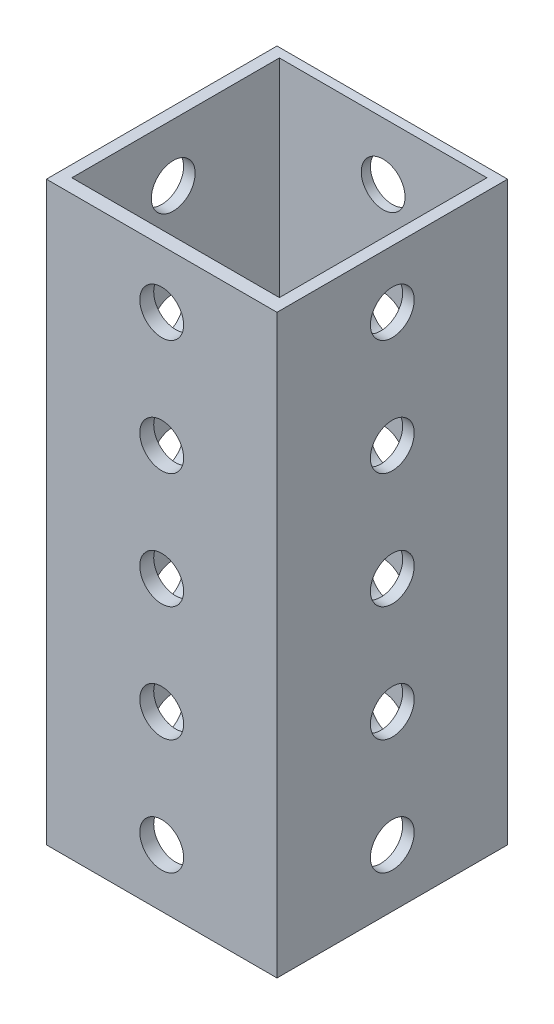
ISO-10303-21;
HEADER;
FILE_DESCRIPTION(('STEP AP214'),'2;1');
FILE_NAME('part.step','',(''),(''),'','','');
FILE_SCHEMA(('AUTOMOTIVE_DESIGN { 1 0 10303 214 1 1 1 1 }'));
ENDSEC;
DATA;
#1=APPLICATION_CONTEXT('core data for automotive mechanical design processes');
#2=APPLICATION_PROTOCOL_DEFINITION('international standard','automotive_design',2000,#1);
#3=PRODUCT_CONTEXT('',#1,'mechanical');
#4=PRODUCT('Part','Part','',(#3));
#5=PRODUCT_RELATED_PRODUCT_CATEGORY('part','',(#4));
#6=PRODUCT_DEFINITION_FORMATION('','',#4);
#7=PRODUCT_DEFINITION_CONTEXT('part definition',#1,'design');
#8=PRODUCT_DEFINITION('design','',#6,#7);
#9=PRODUCT_DEFINITION_SHAPE('','',#8);
#10=(LENGTH_UNIT() NAMED_UNIT(*) SI_UNIT(.MILLI.,.METRE.));
#11=(NAMED_UNIT(*) PLANE_ANGLE_UNIT() SI_UNIT($,.RADIAN.));
#12=(NAMED_UNIT(*) SI_UNIT($,.STERADIAN.) SOLID_ANGLE_UNIT());
#13=UNCERTAINTY_MEASURE_WITH_UNIT(LENGTH_MEASURE(1.E-05),#10,'distance_accuracy_value','');
#14=(GEOMETRIC_REPRESENTATION_CONTEXT(3) GLOBAL_UNCERTAINTY_ASSIGNED_CONTEXT((#13)) GLOBAL_UNIT_ASSIGNED_CONTEXT((#10,
#11,#12)) REPRESENTATION_CONTEXT('',''));
#15=CARTESIAN_POINT('',(0.,0.,0.));
#16=DIRECTION('',(0.,0.,1.));
#17=DIRECTION('',(1.,0.,0.));
#18=AXIS2_PLACEMENT_3D('',#15,#16,#17);
#19=CARTESIAN_POINT('',(0.,63.5,0.));
#20=DIRECTION('',(0.,-1.,0.));
#21=DIRECTION('',(0.,0.,-1.));
#22=AXIS2_PLACEMENT_3D('',#19,#20,#21);
#23=PLANE('',#22);
#24=DIRECTION('',(0.,0.,-1.));
#25=VECTOR('',#24,1.);
#26=CARTESIAN_POINT('',(12.7,63.5,12.7));
#27=LINE('',#26,#25);
#28=CARTESIAN_POINT('',(12.7,63.5,12.7));
#29=VERTEX_POINT('',#28);
#30=CARTESIAN_POINT('',(12.7,63.5,-12.7));
#31=VERTEX_POINT('',#30);
#32=EDGE_CURVE('E140',#29,#31,#27,.T.);
#33=ORIENTED_EDGE('',*,*,#32,.T.);
#34=DIRECTION('',(-1.,0.,0.));
#35=VECTOR('',#34,1.);
#36=CARTESIAN_POINT('',(-12.7,63.5,-12.7));
#37=LINE('',#36,#35);
#38=CARTESIAN_POINT('',(-12.7,63.5,-12.7));
#39=VERTEX_POINT('',#38);
#40=EDGE_CURVE('E143',#31,#39,#37,.T.);
#41=ORIENTED_EDGE('',*,*,#40,.T.);
#42=DIRECTION('',(0.,0.,1.));
#43=VECTOR('',#42,1.);
#44=CARTESIAN_POINT('',(-12.7,63.5,12.7));
#45=LINE('',#44,#43);
#46=CARTESIAN_POINT('',(-12.7,63.5,12.7));
#47=VERTEX_POINT('',#46);
#48=EDGE_CURVE('E146',#39,#47,#45,.T.);
#49=ORIENTED_EDGE('',*,*,#48,.T.);
#50=DIRECTION('',(1.,0.,0.));
#51=VECTOR('',#50,1.);
#52=CARTESIAN_POINT('',(-12.7,63.5,12.7));
#53=LINE('',#52,#51);
#54=EDGE_CURVE('E148',#47,#29,#53,.T.);
#55=ORIENTED_EDGE('',*,*,#54,.T.);
#56=EDGE_LOOP('',(#33,#41,#49,#55));
#57=FACE_BOUND('',#56,.T.);
#58=DIRECTION('',(0.,0.,-1.));
#59=VECTOR('',#58,1.);
#60=CARTESIAN_POINT('',(11.43,63.5,11.1674519230769));
#61=LINE('',#60,#59);
#62=CARTESIAN_POINT('',(11.43,63.5,11.1674519230769));
#63=VERTEX_POINT('',#62);
#64=CARTESIAN_POINT('',(11.43,63.5,-11.6925480769231));
#65=VERTEX_POINT('',#64);
#66=EDGE_CURVE('E102',#63,#65,#61,.T.);
#67=ORIENTED_EDGE('',*,*,#66,.F.);
#68=DIRECTION('',(1.,0.,0.));
#69=VECTOR('',#68,1.);
#70=CARTESIAN_POINT('',(-11.43,63.5,11.1674519230769));
#71=LINE('',#70,#69);
#72=CARTESIAN_POINT('',(-11.43,63.5,11.1674519230769));
#73=VERTEX_POINT('',#72);
#74=EDGE_CURVE('E124',#73,#63,#71,.T.);
#75=ORIENTED_EDGE('',*,*,#74,.F.);
#76=DIRECTION('',(0.,0.,1.));
#77=VECTOR('',#76,1.);
#78=CARTESIAN_POINT('',(-11.43,63.5,11.1674519230769));
#79=LINE('',#78,#77);
#80=CARTESIAN_POINT('',(-11.43,63.5,-11.6925480769231));
#81=VERTEX_POINT('',#80);
#82=EDGE_CURVE('E122',#81,#73,#79,.T.);
#83=ORIENTED_EDGE('',*,*,#82,.F.);
#84=DIRECTION('',(-1.,0.,0.));
#85=VECTOR('',#84,1.);
#86=CARTESIAN_POINT('',(-11.43,63.5,-11.6925480769231));
#87=LINE('',#86,#85);
#88=EDGE_CURVE('E110',#65,#81,#87,.T.);
#89=ORIENTED_EDGE('',*,*,#88,.F.);
#90=EDGE_LOOP('',(#67,#75,#83,#89));
#91=FACE_BOUND('',#90,.T.);
#92=ADVANCED_FACE('F35',(#57,#91),#23,.F.);
#93=CARTESIAN_POINT('',(0.,0.,0.));
#94=DIRECTION('',(0.,-1.,0.));
#95=DIRECTION('',(0.,0.,-1.));
#96=AXIS2_PLACEMENT_3D('',#93,#94,#95);
#97=PLANE('',#96);
#98=DIRECTION('',(0.,0.,-1.));
#99=VECTOR('',#98,1.);
#100=CARTESIAN_POINT('',(12.7,0.,12.7));
#101=LINE('',#100,#99);
#102=CARTESIAN_POINT('',(12.7,0.,12.7));
#103=VERTEX_POINT('',#102);
#104=CARTESIAN_POINT('',(12.7,0.,-12.7));
#105=VERTEX_POINT('',#104);
#106=EDGE_CURVE('E118',#103,#105,#101,.T.);
#107=ORIENTED_EDGE('',*,*,#106,.F.);
#108=DIRECTION('',(1.,0.,0.));
#109=VECTOR('',#108,1.);
#110=CARTESIAN_POINT('',(-12.7,0.,12.7));
#111=LINE('',#110,#109);
#112=CARTESIAN_POINT('',(-12.7,0.,12.7));
#113=VERTEX_POINT('',#112);
#114=EDGE_CURVE('E144',#113,#103,#111,.T.);
#115=ORIENTED_EDGE('',*,*,#114,.F.);
#116=DIRECTION('',(0.,0.,1.));
#117=VECTOR('',#116,1.);
#118=CARTESIAN_POINT('',(-12.7,0.,12.7));
#119=LINE('',#118,#117);
#120=CARTESIAN_POINT('',(-12.7,0.,-12.7));
#121=VERTEX_POINT('',#120);
#122=EDGE_CURVE('E155',#121,#113,#119,.T.);
#123=ORIENTED_EDGE('',*,*,#122,.F.);
#124=DIRECTION('',(-1.,0.,0.));
#125=VECTOR('',#124,1.);
#126=CARTESIAN_POINT('',(-12.7,0.,-12.7));
#127=LINE('',#126,#125);
#128=EDGE_CURVE('E153',#105,#121,#127,.T.);
#129=ORIENTED_EDGE('',*,*,#128,.F.);
#130=EDGE_LOOP('',(#107,#115,#123,#129));
#131=FACE_BOUND('',#130,.T.);
#132=DIRECTION('',(1.,0.,0.));
#133=VECTOR('',#132,1.);
#134=CARTESIAN_POINT('',(-11.43,0.,11.1674519230769));
#135=LINE('',#134,#133);
#136=CARTESIAN_POINT('',(-11.43,0.,11.1674519230769));
#137=VERTEX_POINT('',#136);
#138=CARTESIAN_POINT('',(11.43,0.,11.1674519230769));
#139=VERTEX_POINT('',#138);
#140=EDGE_CURVE('E111',#137,#139,#135,.T.);
#141=ORIENTED_EDGE('',*,*,#140,.T.);
#142=DIRECTION('',(0.,0.,-1.));
#143=VECTOR('',#142,1.);
#144=CARTESIAN_POINT('',(11.43,0.,11.1674519230769));
#145=LINE('',#144,#143);
#146=CARTESIAN_POINT('',(11.43,0.,-11.6925480769231));
#147=VERTEX_POINT('',#146);
#148=EDGE_CURVE('E60',#139,#147,#145,.T.);
#149=ORIENTED_EDGE('',*,*,#148,.T.);
#150=DIRECTION('',(-1.,0.,0.));
#151=VECTOR('',#150,1.);
#152=CARTESIAN_POINT('',(-11.43,0.,-11.6925480769231));
#153=LINE('',#152,#151);
#154=CARTESIAN_POINT('',(-11.43,0.,-11.6925480769231));
#155=VERTEX_POINT('',#154);
#156=EDGE_CURVE('E117',#147,#155,#153,.T.);
#157=ORIENTED_EDGE('',*,*,#156,.T.);
#158=DIRECTION('',(0.,0.,1.));
#159=VECTOR('',#158,1.);
#160=CARTESIAN_POINT('',(-11.43,0.,11.1674519230769));
#161=LINE('',#160,#159);
#162=EDGE_CURVE('E132',#155,#137,#161,.T.);
#163=ORIENTED_EDGE('',*,*,#162,.T.);
#164=EDGE_LOOP('',(#141,#149,#157,#163));
#165=FACE_BOUND('',#164,.T.);
#166=ADVANCED_FACE('F291',(#131,#165),#97,.T.);
#167=CARTESIAN_POINT('',(12.7,63.5,12.7));
#168=DIRECTION('',(-1.,0.,0.));
#169=DIRECTION('',(0.,0.,1.));
#170=AXIS2_PLACEMENT_3D('',#167,#168,#169);
#171=PLANE('',#170);
#172=CARTESIAN_POINT('',(12.7,57.15,0.));
#173=DIRECTION('',(1.,0.,0.));
#174=DIRECTION('',(0.,0.,-1.));
#175=AXIS2_PLACEMENT_3D('',#172,#173,#174);
#176=CIRCLE('',#175,2.413);
#177=CARTESIAN_POINT('',(12.7,57.15,-2.413));
#178=VERTEX_POINT('',#177);
#179=EDGE_CURVE('E568',#178,#178,#176,.T.);
#180=ORIENTED_EDGE('',*,*,#179,.F.);
#181=EDGE_LOOP('',(#180));
#182=FACE_BOUND('',#181,.T.);
#183=CARTESIAN_POINT('',(12.7,44.45,0.));
#184=DIRECTION('',(1.,0.,0.));
#185=DIRECTION('',(0.,0.,-1.));
#186=AXIS2_PLACEMENT_3D('',#183,#184,#185);
#187=CIRCLE('',#186,2.413);
#188=CARTESIAN_POINT('',(12.7,44.45,-2.413));
#189=VERTEX_POINT('',#188);
#190=EDGE_CURVE('E571',#189,#189,#187,.T.);
#191=ORIENTED_EDGE('',*,*,#190,.F.);
#192=EDGE_LOOP('',(#191));
#193=FACE_BOUND('',#192,.T.);
#194=CARTESIAN_POINT('',(12.7,31.75,0.));
#195=DIRECTION('',(1.,0.,0.));
#196=DIRECTION('',(0.,0.,-1.));
#197=AXIS2_PLACEMENT_3D('',#194,#195,#196);
#198=CIRCLE('',#197,2.413);
#199=CARTESIAN_POINT('',(12.7,31.75,-2.413));
#200=VERTEX_POINT('',#199);
#201=EDGE_CURVE('E577',#200,#200,#198,.T.);
#202=ORIENTED_EDGE('',*,*,#201,.F.);
#203=EDGE_LOOP('',(#202));
#204=FACE_BOUND('',#203,.T.);
#205=CARTESIAN_POINT('',(12.7,19.05,0.));
#206=DIRECTION('',(1.,0.,0.));
#207=DIRECTION('',(0.,0.,-1.));
#208=AXIS2_PLACEMENT_3D('',#205,#206,#207);
#209=CIRCLE('',#208,2.413);
#210=CARTESIAN_POINT('',(12.7,19.05,-2.413));
#211=VERTEX_POINT('',#210);
#212=EDGE_CURVE('E334',#211,#211,#209,.T.);
#213=ORIENTED_EDGE('',*,*,#212,.F.);
#214=EDGE_LOOP('',(#213));
#215=FACE_BOUND('',#214,.T.);
#216=CARTESIAN_POINT('',(12.7,6.35000000000002,0.));
#217=DIRECTION('',(1.,0.,0.));
#218=DIRECTION('',(0.,0.,-1.));
#219=AXIS2_PLACEMENT_3D('',#216,#217,#218);
#220=CIRCLE('',#219,2.413);
#221=CARTESIAN_POINT('',(12.7,6.35000000000002,-2.413));
#222=VERTEX_POINT('',#221);
#223=EDGE_CURVE('E335',#222,#222,#220,.T.);
#224=ORIENTED_EDGE('',*,*,#223,.F.);
#225=EDGE_LOOP('',(#224));
#226=FACE_BOUND('',#225,.T.);
#227=ORIENTED_EDGE('',*,*,#106,.T.);
#228=DIRECTION('',(0.,-1.,0.));
#229=VECTOR('',#228,1.);
#230=CARTESIAN_POINT('',(12.7,63.5,-12.7));
#231=LINE('',#230,#229);
#232=EDGE_CURVE('E11',#31,#105,#231,.T.);
#233=ORIENTED_EDGE('',*,*,#232,.F.);
#234=ORIENTED_EDGE('',*,*,#32,.F.);
#235=DIRECTION('',(0.,-1.,0.));
#236=VECTOR('',#235,1.);
#237=CARTESIAN_POINT('',(12.7,63.5,12.7));
#238=LINE('',#237,#236);
#239=EDGE_CURVE('E150',#29,#103,#238,.T.);
#240=ORIENTED_EDGE('',*,*,#239,.T.);
#241=EDGE_LOOP('',(#227,#233,#234,#240));
#242=FACE_BOUND('',#241,.T.);
#243=ADVANCED_FACE('F37',(#182,#193,#204,#215,#226,#242),#171,.F.);
#244=CARTESIAN_POINT('',(-12.7,63.5,-12.7));
#245=DIRECTION('',(0.,0.,1.));
#246=DIRECTION('',(1.,0.,0.));
#247=AXIS2_PLACEMENT_3D('',#244,#245,#246);
#248=PLANE('',#247);
#249=CARTESIAN_POINT('',(0.,57.15,-12.7));
#250=DIRECTION('',(0.,0.,-1.));
#251=DIRECTION('',(-1.,0.,0.));
#252=AXIS2_PLACEMENT_3D('',#249,#250,#251);
#253=CIRCLE('',#252,2.413);
#254=CARTESIAN_POINT('',(-2.413,57.15,-12.7));
#255=VERTEX_POINT('',#254);
#256=EDGE_CURVE('E217',#255,#255,#253,.T.);
#257=ORIENTED_EDGE('',*,*,#256,.F.);
#258=EDGE_LOOP('',(#257));
#259=FACE_BOUND('',#258,.T.);
#260=CARTESIAN_POINT('',(0.,44.45,-12.7));
#261=DIRECTION('',(0.,0.,-1.));
#262=DIRECTION('',(-1.,0.,0.));
#263=AXIS2_PLACEMENT_3D('',#260,#261,#262);
#264=CIRCLE('',#263,2.413);
#265=CARTESIAN_POINT('',(-2.413,44.45,-12.7));
#266=VERTEX_POINT('',#265);
#267=EDGE_CURVE('E223',#266,#266,#264,.T.);
#268=ORIENTED_EDGE('',*,*,#267,.F.);
#269=EDGE_LOOP('',(#268));
#270=FACE_BOUND('',#269,.T.);
#271=CARTESIAN_POINT('',(0.,31.75,-12.7));
#272=DIRECTION('',(0.,0.,-1.));
#273=DIRECTION('',(-1.,0.,0.));
#274=AXIS2_PLACEMENT_3D('',#271,#272,#273);
#275=CIRCLE('',#274,2.413);
#276=CARTESIAN_POINT('',(-2.413,31.75,-12.7));
#277=VERTEX_POINT('',#276);
#278=EDGE_CURVE('E229',#277,#277,#275,.T.);
#279=ORIENTED_EDGE('',*,*,#278,.F.);
#280=EDGE_LOOP('',(#279));
#281=FACE_BOUND('',#280,.T.);
#282=CARTESIAN_POINT('',(0.,19.05,-12.7));
#283=DIRECTION('',(0.,0.,-1.));
#284=DIRECTION('',(-1.,0.,0.));
#285=AXIS2_PLACEMENT_3D('',#282,#283,#284);
#286=CIRCLE('',#285,2.413);
#287=CARTESIAN_POINT('',(-2.413,19.05,-12.7));
#288=VERTEX_POINT('',#287);
#289=EDGE_CURVE('E235',#288,#288,#286,.T.);
#290=ORIENTED_EDGE('',*,*,#289,.F.);
#291=EDGE_LOOP('',(#290));
#292=FACE_BOUND('',#291,.T.);
#293=CARTESIAN_POINT('',(0.,6.35000000000002,-12.7));
#294=DIRECTION('',(0.,0.,-1.));
#295=DIRECTION('',(-1.,0.,0.));
#296=AXIS2_PLACEMENT_3D('',#293,#294,#295);
#297=CIRCLE('',#296,2.413);
#298=CARTESIAN_POINT('',(-2.413,6.35000000000002,-12.7));
#299=VERTEX_POINT('',#298);
#300=EDGE_CURVE('E214',#299,#299,#297,.T.);
#301=ORIENTED_EDGE('',*,*,#300,.F.);
#302=EDGE_LOOP('',(#301));
#303=FACE_BOUND('',#302,.T.);
#304=ORIENTED_EDGE('',*,*,#128,.T.);
#305=DIRECTION('',(0.,-1.,0.));
#306=VECTOR('',#305,1.);
#307=CARTESIAN_POINT('',(-12.7,63.5,-12.7));
#308=LINE('',#307,#306);
#309=EDGE_CURVE('E44',#39,#121,#308,.T.);
#310=ORIENTED_EDGE('',*,*,#309,.F.);
#311=ORIENTED_EDGE('',*,*,#40,.F.);
#312=ORIENTED_EDGE('',*,*,#232,.T.);
#313=EDGE_LOOP('',(#304,#310,#311,#312));
#314=FACE_BOUND('',#313,.T.);
#315=ADVANCED_FACE('F277',(#259,#270,#281,#292,#303,#314),#248,.F.);
#316=CARTESIAN_POINT('',(-12.7,63.5,12.7));
#317=DIRECTION('',(1.,0.,0.));
#318=DIRECTION('',(0.,0.,-1.));
#319=AXIS2_PLACEMENT_3D('',#316,#317,#318);
#320=PLANE('',#319);
#321=CARTESIAN_POINT('',(-12.7,57.15,0.));
#322=DIRECTION('',(1.,0.,0.));
#323=DIRECTION('',(0.,0.,-1.));
#324=AXIS2_PLACEMENT_3D('',#321,#322,#323);
#325=CIRCLE('',#324,2.413);
#326=CARTESIAN_POINT('',(-12.7,57.15,-2.413));
#327=VERTEX_POINT('',#326);
#328=EDGE_CURVE('E189',#327,#327,#325,.T.);
#329=ORIENTED_EDGE('',*,*,#328,.T.);
#330=EDGE_LOOP('',(#329));
#331=FACE_BOUND('',#330,.T.);
#332=CARTESIAN_POINT('',(-12.7,44.45,0.));
#333=DIRECTION('',(1.,0.,0.));
#334=DIRECTION('',(0.,0.,-1.));
#335=AXIS2_PLACEMENT_3D('',#332,#333,#334);
#336=CIRCLE('',#335,2.413);
#337=CARTESIAN_POINT('',(-12.7,44.45,-2.413));
#338=VERTEX_POINT('',#337);
#339=EDGE_CURVE('E321',#338,#338,#336,.T.);
#340=ORIENTED_EDGE('',*,*,#339,.T.);
#341=EDGE_LOOP('',(#340));
#342=FACE_BOUND('',#341,.T.);
#343=CARTESIAN_POINT('',(-12.7,31.75,0.));
#344=DIRECTION('',(1.,0.,0.));
#345=DIRECTION('',(0.,0.,-1.));
#346=AXIS2_PLACEMENT_3D('',#343,#344,#345);
#347=CIRCLE('',#346,2.413);
#348=CARTESIAN_POINT('',(-12.7,31.75,-2.413));
#349=VERTEX_POINT('',#348);
#350=EDGE_CURVE('E325',#349,#349,#347,.T.);
#351=ORIENTED_EDGE('',*,*,#350,.T.);
#352=EDGE_LOOP('',(#351));
#353=FACE_BOUND('',#352,.T.);
#354=CARTESIAN_POINT('',(-12.7,19.05,0.));
#355=DIRECTION('',(1.,0.,0.));
#356=DIRECTION('',(0.,0.,-1.));
#357=AXIS2_PLACEMENT_3D('',#354,#355,#356);
#358=CIRCLE('',#357,2.413);
#359=CARTESIAN_POINT('',(-12.7,19.05,-2.413));
#360=VERTEX_POINT('',#359);
#361=EDGE_CURVE('E329',#360,#360,#358,.T.);
#362=ORIENTED_EDGE('',*,*,#361,.T.);
#363=EDGE_LOOP('',(#362));
#364=FACE_BOUND('',#363,.T.);
#365=CARTESIAN_POINT('',(-12.7,6.35000000000002,0.));
#366=DIRECTION('',(1.,0.,0.));
#367=DIRECTION('',(0.,0.,-1.));
#368=AXIS2_PLACEMENT_3D('',#365,#366,#367);
#369=CIRCLE('',#368,2.413);
#370=CARTESIAN_POINT('',(-12.7,6.35000000000002,-2.413));
#371=VERTEX_POINT('',#370);
#372=EDGE_CURVE('E332',#371,#371,#369,.T.);
#373=ORIENTED_EDGE('',*,*,#372,.T.);
#374=EDGE_LOOP('',(#373));
#375=FACE_BOUND('',#374,.T.);
#376=ORIENTED_EDGE('',*,*,#122,.T.);
#377=DIRECTION('',(0.,-1.,0.));
#378=VECTOR('',#377,1.);
#379=CARTESIAN_POINT('',(-12.7,63.5,12.7));
#380=LINE('',#379,#378);
#381=EDGE_CURVE('E160',#47,#113,#380,.T.);
#382=ORIENTED_EDGE('',*,*,#381,.F.);
#383=ORIENTED_EDGE('',*,*,#48,.F.);
#384=ORIENTED_EDGE('',*,*,#309,.T.);
#385=EDGE_LOOP('',(#376,#382,#383,#384));
#386=FACE_BOUND('',#385,.T.);
#387=ADVANCED_FACE('F280',(#331,#342,#353,#364,#375,#386),#320,.F.);
#388=CARTESIAN_POINT('',(-12.7,63.5,12.7));
#389=DIRECTION('',(0.,0.,-1.));
#390=DIRECTION('',(-1.,0.,0.));
#391=AXIS2_PLACEMENT_3D('',#388,#389,#390);
#392=PLANE('',#391);
#393=CARTESIAN_POINT('',(0.,57.15,12.7));
#394=DIRECTION('',(0.,0.,-1.));
#395=DIRECTION('',(-1.,0.,0.));
#396=AXIS2_PLACEMENT_3D('',#393,#394,#395);
#397=CIRCLE('',#396,2.413);
#398=CARTESIAN_POINT('',(-2.413,57.15,12.7));
#399=VERTEX_POINT('',#398);
#400=EDGE_CURVE('E169',#399,#399,#397,.T.);
#401=ORIENTED_EDGE('',*,*,#400,.T.);
#402=EDGE_LOOP('',(#401));
#403=FACE_BOUND('',#402,.T.);
#404=CARTESIAN_POINT('',(0.,44.45,12.7));
#405=DIRECTION('',(0.,0.,-1.));
#406=DIRECTION('',(-1.,0.,0.));
#407=AXIS2_PLACEMENT_3D('',#404,#405,#406);
#408=CIRCLE('',#407,2.413);
#409=CARTESIAN_POINT('',(-2.413,44.45,12.7));
#410=VERTEX_POINT('',#409);
#411=EDGE_CURVE('E220',#410,#410,#408,.T.);
#412=ORIENTED_EDGE('',*,*,#411,.T.);
#413=EDGE_LOOP('',(#412));
#414=FACE_BOUND('',#413,.T.);
#415=CARTESIAN_POINT('',(0.,31.75,12.7));
#416=DIRECTION('',(0.,0.,-1.));
#417=DIRECTION('',(-1.,0.,0.));
#418=AXIS2_PLACEMENT_3D('',#415,#416,#417);
#419=CIRCLE('',#418,2.413);
#420=CARTESIAN_POINT('',(-2.413,31.75,12.7));
#421=VERTEX_POINT('',#420);
#422=EDGE_CURVE('E226',#421,#421,#419,.T.);
#423=ORIENTED_EDGE('',*,*,#422,.T.);
#424=EDGE_LOOP('',(#423));
#425=FACE_BOUND('',#424,.T.);
#426=CARTESIAN_POINT('',(0.,19.05,12.7));
#427=DIRECTION('',(0.,0.,-1.));
#428=DIRECTION('',(-1.,0.,0.));
#429=AXIS2_PLACEMENT_3D('',#426,#427,#428);
#430=CIRCLE('',#429,2.413);
#431=CARTESIAN_POINT('',(-2.413,19.05,12.7));
#432=VERTEX_POINT('',#431);
#433=EDGE_CURVE('E232',#432,#432,#430,.T.);
#434=ORIENTED_EDGE('',*,*,#433,.T.);
#435=EDGE_LOOP('',(#434));
#436=FACE_BOUND('',#435,.T.);
#437=CARTESIAN_POINT('',(0.,6.35000000000002,12.7));
#438=DIRECTION('',(0.,0.,-1.));
#439=DIRECTION('',(-1.,0.,0.));
#440=AXIS2_PLACEMENT_3D('',#437,#438,#439);
#441=CIRCLE('',#440,2.413);
#442=CARTESIAN_POINT('',(-2.413,6.35000000000002,12.7));
#443=VERTEX_POINT('',#442);
#444=EDGE_CURVE('E238',#443,#443,#441,.T.);
#445=ORIENTED_EDGE('',*,*,#444,.T.);
#446=EDGE_LOOP('',(#445));
#447=FACE_BOUND('',#446,.T.);
#448=ORIENTED_EDGE('',*,*,#114,.T.);
#449=ORIENTED_EDGE('',*,*,#239,.F.);
#450=ORIENTED_EDGE('',*,*,#54,.F.);
#451=ORIENTED_EDGE('',*,*,#381,.T.);
#452=EDGE_LOOP('',(#448,#449,#450,#451));
#453=FACE_BOUND('',#452,.T.);
#454=ADVANCED_FACE('F295',(#403,#414,#425,#436,#447,#453),#392,.F.);
#455=CARTESIAN_POINT('',(11.43,63.5,11.1674519230769));
#456=DIRECTION('',(-1.,0.,0.));
#457=DIRECTION('',(0.,0.,1.));
#458=AXIS2_PLACEMENT_3D('',#455,#456,#457);
#459=PLANE('',#458);
#460=CARTESIAN_POINT('',(11.43,57.15,0.));
#461=DIRECTION('',(-1.,0.,0.));
#462=DIRECTION('',(0.,0.,1.));
#463=AXIS2_PLACEMENT_3D('',#460,#461,#462);
#464=CIRCLE('',#463,2.413);
#465=CARTESIAN_POINT('',(11.43,57.15,2.413));
#466=VERTEX_POINT('',#465);
#467=EDGE_CURVE('E211',#466,#466,#464,.T.);
#468=ORIENTED_EDGE('',*,*,#467,.F.);
#469=EDGE_LOOP('',(#468));
#470=FACE_BOUND('',#469,.T.);
#471=CARTESIAN_POINT('',(11.43,44.45,0.));
#472=DIRECTION('',(-1.,0.,0.));
#473=DIRECTION('',(0.,0.,1.));
#474=AXIS2_PLACEMENT_3D('',#471,#472,#473);
#475=CIRCLE('',#474,2.413);
#476=CARTESIAN_POINT('',(11.43,44.45,2.413));
#477=VERTEX_POINT('',#476);
#478=EDGE_CURVE('E199',#477,#477,#475,.T.);
#479=ORIENTED_EDGE('',*,*,#478,.F.);
#480=EDGE_LOOP('',(#479));
#481=FACE_BOUND('',#480,.T.);
#482=CARTESIAN_POINT('',(11.43,31.75,0.));
#483=DIRECTION('',(-1.,0.,0.));
#484=DIRECTION('',(0.,0.,1.));
#485=AXIS2_PLACEMENT_3D('',#482,#483,#484);
#486=CIRCLE('',#485,2.413);
#487=CARTESIAN_POINT('',(11.43,31.75,2.413));
#488=VERTEX_POINT('',#487);
#489=EDGE_CURVE('E196',#488,#488,#486,.T.);
#490=ORIENTED_EDGE('',*,*,#489,.F.);
#491=EDGE_LOOP('',(#490));
#492=FACE_BOUND('',#491,.T.);
#493=CARTESIAN_POINT('',(11.43,19.05,0.));
#494=DIRECTION('',(-1.,0.,0.));
#495=DIRECTION('',(0.,0.,1.));
#496=AXIS2_PLACEMENT_3D('',#493,#494,#495);
#497=CIRCLE('',#496,2.413);
#498=CARTESIAN_POINT('',(11.43,19.05,2.413));
#499=VERTEX_POINT('',#498);
#500=EDGE_CURVE('E193',#499,#499,#497,.T.);
#501=ORIENTED_EDGE('',*,*,#500,.F.);
#502=EDGE_LOOP('',(#501));
#503=FACE_BOUND('',#502,.T.);
#504=CARTESIAN_POINT('',(11.43,6.35000000000002,0.));
#505=DIRECTION('',(-1.,0.,0.));
#506=DIRECTION('',(0.,0.,1.));
#507=AXIS2_PLACEMENT_3D('',#504,#505,#506);
#508=CIRCLE('',#507,2.413);
#509=CARTESIAN_POINT('',(11.43,6.35000000000002,2.413));
#510=VERTEX_POINT('',#509);
#511=EDGE_CURVE('E188',#510,#510,#508,.T.);
#512=ORIENTED_EDGE('',*,*,#511,.F.);
#513=EDGE_LOOP('',(#512));
#514=FACE_BOUND('',#513,.T.);
#515=ORIENTED_EDGE('',*,*,#148,.F.);
#516=DIRECTION('',(0.,-1.,0.));
#517=VECTOR('',#516,1.);
#518=CARTESIAN_POINT('',(11.43,63.5,11.1674519230769));
#519=LINE('',#518,#517);
#520=EDGE_CURVE('E106',#63,#139,#519,.T.);
#521=ORIENTED_EDGE('',*,*,#520,.F.);
#522=ORIENTED_EDGE('',*,*,#66,.T.);
#523=DIRECTION('',(0.,-1.,0.));
#524=VECTOR('',#523,1.);
#525=CARTESIAN_POINT('',(11.43,63.5,-11.6925480769231));
#526=LINE('',#525,#524);
#527=EDGE_CURVE('E105',#65,#147,#526,.T.);
#528=ORIENTED_EDGE('',*,*,#527,.T.);
#529=EDGE_LOOP('',(#515,#521,#522,#528));
#530=FACE_BOUND('',#529,.T.);
#531=ADVANCED_FACE('F104',(#470,#481,#492,#503,#514,#530),#459,.T.);
#532=CARTESIAN_POINT('',(-11.43,63.5,-11.6925480769231));
#533=DIRECTION('',(0.,0.,1.));
#534=DIRECTION('',(1.,0.,0.));
#535=AXIS2_PLACEMENT_3D('',#532,#533,#534);
#536=PLANE('',#535);
#537=CARTESIAN_POINT('',(0.,57.15,-11.6925480769231));
#538=DIRECTION('',(0.,0.,1.));
#539=DIRECTION('',(1.,0.,0.));
#540=AXIS2_PLACEMENT_3D('',#537,#538,#539);
#541=CIRCLE('',#540,2.413);
#542=CARTESIAN_POINT('',(2.413,57.15,-11.6925480769231));
#543=VERTEX_POINT('',#542);
#544=EDGE_CURVE('E130',#543,#543,#541,.T.);
#545=ORIENTED_EDGE('',*,*,#544,.F.);
#546=EDGE_LOOP('',(#545));
#547=FACE_BOUND('',#546,.T.);
#548=CARTESIAN_POINT('',(0.,44.45,-11.6925480769231));
#549=DIRECTION('',(0.,0.,1.));
#550=DIRECTION('',(1.,0.,0.));
#551=AXIS2_PLACEMENT_3D('',#548,#549,#550);
#552=CIRCLE('',#551,2.413);
#553=CARTESIAN_POINT('',(2.41299999999999,44.45,-11.6925480769231));
#554=VERTEX_POINT('',#553);
#555=EDGE_CURVE('E181',#554,#554,#552,.T.);
#556=ORIENTED_EDGE('',*,*,#555,.F.);
#557=EDGE_LOOP('',(#556));
#558=FACE_BOUND('',#557,.T.);
#559=CARTESIAN_POINT('',(0.,31.75,-11.6925480769231));
#560=DIRECTION('',(0.,0.,1.));
#561=DIRECTION('',(1.,0.,0.));
#562=AXIS2_PLACEMENT_3D('',#559,#560,#561);
#563=CIRCLE('',#562,2.413);
#564=CARTESIAN_POINT('',(2.41299999999999,31.75,-11.6925480769231));
#565=VERTEX_POINT('',#564);
#566=EDGE_CURVE('E177',#565,#565,#563,.T.);
#567=ORIENTED_EDGE('',*,*,#566,.F.);
#568=EDGE_LOOP('',(#567));
#569=FACE_BOUND('',#568,.T.);
#570=CARTESIAN_POINT('',(0.,19.05,-11.6925480769231));
#571=DIRECTION('',(0.,0.,1.));
#572=DIRECTION('',(1.,0.,0.));
#573=AXIS2_PLACEMENT_3D('',#570,#571,#572);
#574=CIRCLE('',#573,2.413);
#575=CARTESIAN_POINT('',(2.41299999999999,19.05,-11.6925480769231));
#576=VERTEX_POINT('',#575);
#577=EDGE_CURVE('E173',#576,#576,#574,.T.);
#578=ORIENTED_EDGE('',*,*,#577,.F.);
#579=EDGE_LOOP('',(#578));
#580=FACE_BOUND('',#579,.T.);
#581=CARTESIAN_POINT('',(0.,6.35000000000002,-11.6925480769231));
#582=DIRECTION('',(0.,0.,1.));
#583=DIRECTION('',(1.,0.,0.));
#584=AXIS2_PLACEMENT_3D('',#581,#582,#583);
#585=CIRCLE('',#584,2.413);
#586=CARTESIAN_POINT('',(2.41299999999999,6.35000000000002,-11.6925480769231));
#587=VERTEX_POINT('',#586);
#588=EDGE_CURVE('E168',#587,#587,#585,.T.);
#589=ORIENTED_EDGE('',*,*,#588,.F.);
#590=EDGE_LOOP('',(#589));
#591=FACE_BOUND('',#590,.T.);
#592=ORIENTED_EDGE('',*,*,#156,.F.);
#593=ORIENTED_EDGE('',*,*,#527,.F.);
#594=ORIENTED_EDGE('',*,*,#88,.T.);
#595=DIRECTION('',(0.,-1.,0.));
#596=VECTOR('',#595,1.);
#597=CARTESIAN_POINT('',(-11.43,63.5,-11.6925480769231));
#598=LINE('',#597,#596);
#599=EDGE_CURVE('E119',#81,#155,#598,.T.);
#600=ORIENTED_EDGE('',*,*,#599,.T.);
#601=EDGE_LOOP('',(#592,#593,#594,#600));
#602=FACE_BOUND('',#601,.T.);
#603=ADVANCED_FACE('F114',(#547,#558,#569,#580,#591,#602),#536,.T.);
#604=CARTESIAN_POINT('',(-11.43,63.5,11.1674519230769));
#605=DIRECTION('',(1.,0.,0.));
#606=DIRECTION('',(0.,0.,-1.));
#607=AXIS2_PLACEMENT_3D('',#604,#605,#606);
#608=PLANE('',#607);
#609=CARTESIAN_POINT('',(-11.43,57.15,0.));
#610=DIRECTION('',(1.,0.,0.));
#611=DIRECTION('',(0.,0.,-1.));
#612=AXIS2_PLACEMENT_3D('',#609,#610,#611);
#613=CIRCLE('',#612,2.413);
#614=CARTESIAN_POINT('',(-11.43,57.15,-2.413));
#615=VERTEX_POINT('',#614);
#616=EDGE_CURVE('E39',#615,#615,#613,.T.);
#617=ORIENTED_EDGE('',*,*,#616,.F.);
#618=EDGE_LOOP('',(#617));
#619=FACE_BOUND('',#618,.T.);
#620=CARTESIAN_POINT('',(-11.43,44.45,0.));
#621=DIRECTION('',(1.,0.,0.));
#622=DIRECTION('',(0.,0.,-1.));
#623=AXIS2_PLACEMENT_3D('',#620,#621,#622);
#624=CIRCLE('',#623,2.413);
#625=CARTESIAN_POINT('',(-11.43,44.45,-2.413));
#626=VERTEX_POINT('',#625);
#627=EDGE_CURVE('E197',#626,#626,#624,.T.);
#628=ORIENTED_EDGE('',*,*,#627,.F.);
#629=EDGE_LOOP('',(#628));
#630=FACE_BOUND('',#629,.T.);
#631=CARTESIAN_POINT('',(-11.43,31.75,0.));
#632=DIRECTION('',(1.,0.,0.));
#633=DIRECTION('',(0.,0.,-1.));
#634=AXIS2_PLACEMENT_3D('',#631,#632,#633);
#635=CIRCLE('',#634,2.413);
#636=CARTESIAN_POINT('',(-11.43,31.75,-2.413));
#637=VERTEX_POINT('',#636);
#638=EDGE_CURVE('E194',#637,#637,#635,.T.);
#639=ORIENTED_EDGE('',*,*,#638,.F.);
#640=EDGE_LOOP('',(#639));
#641=FACE_BOUND('',#640,.T.);
#642=CARTESIAN_POINT('',(-11.43,19.05,0.));
#643=DIRECTION('',(1.,0.,0.));
#644=DIRECTION('',(0.,0.,-1.));
#645=AXIS2_PLACEMENT_3D('',#642,#643,#644);
#646=CIRCLE('',#645,2.413);
#647=CARTESIAN_POINT('',(-11.43,19.05,-2.413));
#648=VERTEX_POINT('',#647);
#649=EDGE_CURVE('E190',#648,#648,#646,.T.);
#650=ORIENTED_EDGE('',*,*,#649,.F.);
#651=EDGE_LOOP('',(#650));
#652=FACE_BOUND('',#651,.T.);
#653=CARTESIAN_POINT('',(-11.43,6.35000000000002,0.));
#654=DIRECTION('',(1.,0.,0.));
#655=DIRECTION('',(0.,0.,-1.));
#656=AXIS2_PLACEMENT_3D('',#653,#654,#655);
#657=CIRCLE('',#656,2.413);
#658=CARTESIAN_POINT('',(-11.43,6.35000000000002,-2.413));
#659=VERTEX_POINT('',#658);
#660=EDGE_CURVE('E185',#659,#659,#657,.T.);
#661=ORIENTED_EDGE('',*,*,#660,.F.);
#662=EDGE_LOOP('',(#661));
#663=FACE_BOUND('',#662,.T.);
#664=ORIENTED_EDGE('',*,*,#162,.F.);
#665=ORIENTED_EDGE('',*,*,#599,.F.);
#666=ORIENTED_EDGE('',*,*,#82,.T.);
#667=DIRECTION('',(0.,-1.,0.));
#668=VECTOR('',#667,1.);
#669=CARTESIAN_POINT('',(-11.43,63.5,11.1674519230769));
#670=LINE('',#669,#668);
#671=EDGE_CURVE('E52',#73,#137,#670,.T.);
#672=ORIENTED_EDGE('',*,*,#671,.T.);
#673=EDGE_LOOP('',(#664,#665,#666,#672));
#674=FACE_BOUND('',#673,.T.);
#675=ADVANCED_FACE('F258',(#619,#630,#641,#652,#663,#674),#608,.T.);
#676=CARTESIAN_POINT('',(-11.43,63.5,11.1674519230769));
#677=DIRECTION('',(0.,0.,-1.));
#678=DIRECTION('',(-1.,0.,0.));
#679=AXIS2_PLACEMENT_3D('',#676,#677,#678);
#680=PLANE('',#679);
#681=CARTESIAN_POINT('',(0.,57.15,11.1674519230769));
#682=DIRECTION('',(0.,0.,-1.));
#683=DIRECTION('',(-1.,0.,0.));
#684=AXIS2_PLACEMENT_3D('',#681,#682,#683);
#685=CIRCLE('',#684,2.413);
#686=CARTESIAN_POINT('',(-2.413,57.15,11.1674519230769));
#687=VERTEX_POINT('',#686);
#688=EDGE_CURVE('E182',#687,#687,#685,.T.);
#689=ORIENTED_EDGE('',*,*,#688,.F.);
#690=EDGE_LOOP('',(#689));
#691=FACE_BOUND('',#690,.T.);
#692=CARTESIAN_POINT('',(0.,44.45,11.1674519230769));
#693=DIRECTION('',(0.,0.,-1.));
#694=DIRECTION('',(-1.,0.,0.));
#695=AXIS2_PLACEMENT_3D('',#692,#693,#694);
#696=CIRCLE('',#695,2.413);
#697=CARTESIAN_POINT('',(-2.413,44.45,11.1674519230769));
#698=VERTEX_POINT('',#697);
#699=EDGE_CURVE('E178',#698,#698,#696,.T.);
#700=ORIENTED_EDGE('',*,*,#699,.F.);
#701=EDGE_LOOP('',(#700));
#702=FACE_BOUND('',#701,.T.);
#703=CARTESIAN_POINT('',(0.,31.75,11.1674519230769));
#704=DIRECTION('',(0.,0.,-1.));
#705=DIRECTION('',(-1.,0.,0.));
#706=AXIS2_PLACEMENT_3D('',#703,#704,#705);
#707=CIRCLE('',#706,2.413);
#708=CARTESIAN_POINT('',(-2.413,31.75,11.1674519230769));
#709=VERTEX_POINT('',#708);
#710=EDGE_CURVE('E174',#709,#709,#707,.T.);
#711=ORIENTED_EDGE('',*,*,#710,.F.);
#712=EDGE_LOOP('',(#711));
#713=FACE_BOUND('',#712,.T.);
#714=CARTESIAN_POINT('',(0.,19.05,11.1674519230769));
#715=DIRECTION('',(0.,0.,-1.));
#716=DIRECTION('',(-1.,0.,0.));
#717=AXIS2_PLACEMENT_3D('',#714,#715,#716);
#718=CIRCLE('',#717,2.413);
#719=CARTESIAN_POINT('',(-2.413,19.05,11.1674519230769));
#720=VERTEX_POINT('',#719);
#721=EDGE_CURVE('E170',#720,#720,#718,.T.);
#722=ORIENTED_EDGE('',*,*,#721,.F.);
#723=EDGE_LOOP('',(#722));
#724=FACE_BOUND('',#723,.T.);
#725=CARTESIAN_POINT('',(0.,6.35000000000002,11.1674519230769));
#726=DIRECTION('',(0.,0.,-1.));
#727=DIRECTION('',(-1.,0.,0.));
#728=AXIS2_PLACEMENT_3D('',#725,#726,#727);
#729=CIRCLE('',#728,2.413);
#730=CARTESIAN_POINT('',(-2.413,6.35000000000002,11.1674519230769));
#731=VERTEX_POINT('',#730);
#732=EDGE_CURVE('E165',#731,#731,#729,.T.);
#733=ORIENTED_EDGE('',*,*,#732,.F.);
#734=EDGE_LOOP('',(#733));
#735=FACE_BOUND('',#734,.T.);
#736=ORIENTED_EDGE('',*,*,#140,.F.);
#737=ORIENTED_EDGE('',*,*,#671,.F.);
#738=ORIENTED_EDGE('',*,*,#74,.T.);
#739=ORIENTED_EDGE('',*,*,#520,.T.);
#740=EDGE_LOOP('',(#736,#737,#738,#739));
#741=FACE_BOUND('',#740,.T.);
#742=ADVANCED_FACE('F397',(#691,#702,#713,#724,#735,#741),#680,.T.);
#743=CARTESIAN_POINT('',(0.,6.35000000000002,12.7));
#744=DIRECTION('',(0.,0.,-1.));
#745=DIRECTION('',(-1.,0.,0.));
#746=AXIS2_PLACEMENT_3D('',#743,#744,#745);
#747=CYLINDRICAL_SURFACE('',#746,2.413);
#748=ORIENTED_EDGE('',*,*,#732,.T.);
#749=EDGE_LOOP('',(#748));
#750=FACE_BOUND('',#749,.T.);
#751=ORIENTED_EDGE('',*,*,#444,.F.);
#752=EDGE_LOOP('',(#751));
#753=FACE_BOUND('',#752,.T.);
#754=ADVANCED_FACE('F274',(#750,#753),#747,.F.);
#755=CARTESIAN_POINT('',(0.,19.05,12.7));
#756=DIRECTION('',(0.,0.,-1.));
#757=DIRECTION('',(-1.,0.,0.));
#758=AXIS2_PLACEMENT_3D('',#755,#756,#757);
#759=CYLINDRICAL_SURFACE('',#758,2.413);
#760=ORIENTED_EDGE('',*,*,#721,.T.);
#761=EDGE_LOOP('',(#760));
#762=FACE_BOUND('',#761,.T.);
#763=ORIENTED_EDGE('',*,*,#433,.F.);
#764=EDGE_LOOP('',(#763));
#765=FACE_BOUND('',#764,.T.);
#766=ADVANCED_FACE('F407',(#762,#765),#759,.F.);
#767=CARTESIAN_POINT('',(0.,31.75,12.7));
#768=DIRECTION('',(0.,0.,-1.));
#769=DIRECTION('',(-1.,0.,0.));
#770=AXIS2_PLACEMENT_3D('',#767,#768,#769);
#771=CYLINDRICAL_SURFACE('',#770,2.413);
#772=ORIENTED_EDGE('',*,*,#710,.T.);
#773=EDGE_LOOP('',(#772));
#774=FACE_BOUND('',#773,.T.);
#775=ORIENTED_EDGE('',*,*,#422,.F.);
#776=EDGE_LOOP('',(#775));
#777=FACE_BOUND('',#776,.T.);
#778=ADVANCED_FACE('F414',(#774,#777),#771,.F.);
#779=CARTESIAN_POINT('',(0.,44.45,12.7));
#780=DIRECTION('',(0.,0.,-1.));
#781=DIRECTION('',(-1.,0.,0.));
#782=AXIS2_PLACEMENT_3D('',#779,#780,#781);
#783=CYLINDRICAL_SURFACE('',#782,2.413);
#784=ORIENTED_EDGE('',*,*,#699,.T.);
#785=EDGE_LOOP('',(#784));
#786=FACE_BOUND('',#785,.T.);
#787=ORIENTED_EDGE('',*,*,#411,.F.);
#788=EDGE_LOOP('',(#787));
#789=FACE_BOUND('',#788,.T.);
#790=ADVANCED_FACE('F418',(#786,#789),#783,.F.);
#791=CARTESIAN_POINT('',(0.,57.15,12.7));
#792=DIRECTION('',(0.,0.,-1.));
#793=DIRECTION('',(-1.,0.,0.));
#794=AXIS2_PLACEMENT_3D('',#791,#792,#793);
#795=CYLINDRICAL_SURFACE('',#794,2.413);
#796=ORIENTED_EDGE('',*,*,#688,.T.);
#797=EDGE_LOOP('',(#796));
#798=FACE_BOUND('',#797,.T.);
#799=ORIENTED_EDGE('',*,*,#400,.F.);
#800=EDGE_LOOP('',(#799));
#801=FACE_BOUND('',#800,.T.);
#802=ADVANCED_FACE('F272',(#798,#801),#795,.F.);
#803=ORIENTED_EDGE('',*,*,#588,.T.);
#804=EDGE_LOOP('',(#803));
#805=FACE_BOUND('',#804,.T.);
#806=ORIENTED_EDGE('',*,*,#300,.T.);
#807=EDGE_LOOP('',(#806));
#808=FACE_BOUND('',#807,.T.);
#809=ADVANCED_FACE('F268',(#805,#808),#747,.F.);
#810=ORIENTED_EDGE('',*,*,#577,.T.);
#811=EDGE_LOOP('',(#810));
#812=FACE_BOUND('',#811,.T.);
#813=ORIENTED_EDGE('',*,*,#289,.T.);
#814=EDGE_LOOP('',(#813));
#815=FACE_BOUND('',#814,.T.);
#816=ADVANCED_FACE('F271',(#812,#815),#759,.F.);
#817=ORIENTED_EDGE('',*,*,#566,.T.);
#818=EDGE_LOOP('',(#817));
#819=FACE_BOUND('',#818,.T.);
#820=ORIENTED_EDGE('',*,*,#278,.T.);
#821=EDGE_LOOP('',(#820));
#822=FACE_BOUND('',#821,.T.);
#823=ADVANCED_FACE('F420',(#819,#822),#771,.F.);
#824=ORIENTED_EDGE('',*,*,#555,.T.);
#825=EDGE_LOOP('',(#824));
#826=FACE_BOUND('',#825,.T.);
#827=ORIENTED_EDGE('',*,*,#267,.T.);
#828=EDGE_LOOP('',(#827));
#829=FACE_BOUND('',#828,.T.);
#830=ADVANCED_FACE('F392',(#826,#829),#783,.F.);
#831=ORIENTED_EDGE('',*,*,#544,.T.);
#832=EDGE_LOOP('',(#831));
#833=FACE_BOUND('',#832,.T.);
#834=ORIENTED_EDGE('',*,*,#256,.T.);
#835=EDGE_LOOP('',(#834));
#836=FACE_BOUND('',#835,.T.);
#837=ADVANCED_FACE('F253',(#833,#836),#795,.F.);
#838=CARTESIAN_POINT('',(-12.7,6.35000000000002,0.));
#839=DIRECTION('',(1.,0.,0.));
#840=DIRECTION('',(0.,0.,-1.));
#841=AXIS2_PLACEMENT_3D('',#838,#839,#840);
#842=CYLINDRICAL_SURFACE('',#841,2.413);
#843=ORIENTED_EDGE('',*,*,#660,.T.);
#844=EDGE_LOOP('',(#843));
#845=FACE_BOUND('',#844,.T.);
#846=ORIENTED_EDGE('',*,*,#372,.F.);
#847=EDGE_LOOP('',(#846));
#848=FACE_BOUND('',#847,.T.);
#849=ADVANCED_FACE('F375',(#845,#848),#842,.F.);
#850=CARTESIAN_POINT('',(-12.7,19.05,0.));
#851=DIRECTION('',(1.,0.,0.));
#852=DIRECTION('',(0.,0.,-1.));
#853=AXIS2_PLACEMENT_3D('',#850,#851,#852);
#854=CYLINDRICAL_SURFACE('',#853,2.413);
#855=ORIENTED_EDGE('',*,*,#649,.T.);
#856=EDGE_LOOP('',(#855));
#857=FACE_BOUND('',#856,.T.);
#858=ORIENTED_EDGE('',*,*,#361,.F.);
#859=EDGE_LOOP('',(#858));
#860=FACE_BOUND('',#859,.T.);
#861=ADVANCED_FACE('F365',(#857,#860),#854,.F.);
#862=CARTESIAN_POINT('',(-12.7,31.75,0.));
#863=DIRECTION('',(1.,0.,0.));
#864=DIRECTION('',(0.,0.,-1.));
#865=AXIS2_PLACEMENT_3D('',#862,#863,#864);
#866=CYLINDRICAL_SURFACE('',#865,2.413);
#867=ORIENTED_EDGE('',*,*,#638,.T.);
#868=EDGE_LOOP('',(#867));
#869=FACE_BOUND('',#868,.T.);
#870=ORIENTED_EDGE('',*,*,#350,.F.);
#871=EDGE_LOOP('',(#870));
#872=FACE_BOUND('',#871,.T.);
#873=ADVANCED_FACE('F390',(#869,#872),#866,.F.);
#874=CARTESIAN_POINT('',(-12.7,44.45,0.));
#875=DIRECTION('',(1.,0.,0.));
#876=DIRECTION('',(0.,0.,-1.));
#877=AXIS2_PLACEMENT_3D('',#874,#875,#876);
#878=CYLINDRICAL_SURFACE('',#877,2.413);
#879=ORIENTED_EDGE('',*,*,#627,.T.);
#880=EDGE_LOOP('',(#879));
#881=FACE_BOUND('',#880,.T.);
#882=ORIENTED_EDGE('',*,*,#339,.F.);
#883=EDGE_LOOP('',(#882));
#884=FACE_BOUND('',#883,.T.);
#885=ADVANCED_FACE('F379',(#881,#884),#878,.F.);
#886=CARTESIAN_POINT('',(-12.7,57.15,0.));
#887=DIRECTION('',(1.,0.,0.));
#888=DIRECTION('',(0.,0.,-1.));
#889=AXIS2_PLACEMENT_3D('',#886,#887,#888);
#890=CYLINDRICAL_SURFACE('',#889,2.413);
#891=ORIENTED_EDGE('',*,*,#616,.T.);
#892=EDGE_LOOP('',(#891));
#893=FACE_BOUND('',#892,.T.);
#894=ORIENTED_EDGE('',*,*,#328,.F.);
#895=EDGE_LOOP('',(#894));
#896=FACE_BOUND('',#895,.T.);
#897=ADVANCED_FACE('F373',(#893,#896),#890,.F.);
#898=ORIENTED_EDGE('',*,*,#511,.T.);
#899=EDGE_LOOP('',(#898));
#900=FACE_BOUND('',#899,.T.);
#901=ORIENTED_EDGE('',*,*,#223,.T.);
#902=EDGE_LOOP('',(#901));
#903=FACE_BOUND('',#902,.T.);
#904=ADVANCED_FACE('F345',(#900,#903),#842,.F.);
#905=ORIENTED_EDGE('',*,*,#500,.T.);
#906=EDGE_LOOP('',(#905));
#907=FACE_BOUND('',#906,.T.);
#908=ORIENTED_EDGE('',*,*,#212,.T.);
#909=EDGE_LOOP('',(#908));
#910=FACE_BOUND('',#909,.T.);
#911=ADVANCED_FACE('F360',(#907,#910),#854,.F.);
#912=ORIENTED_EDGE('',*,*,#489,.T.);
#913=EDGE_LOOP('',(#912));
#914=FACE_BOUND('',#913,.T.);
#915=ORIENTED_EDGE('',*,*,#201,.T.);
#916=EDGE_LOOP('',(#915));
#917=FACE_BOUND('',#916,.T.);
#918=ADVANCED_FACE('F363',(#914,#917),#866,.F.);
#919=ORIENTED_EDGE('',*,*,#478,.T.);
#920=EDGE_LOOP('',(#919));
#921=FACE_BOUND('',#920,.T.);
#922=ORIENTED_EDGE('',*,*,#190,.T.);
#923=EDGE_LOOP('',(#922));
#924=FACE_BOUND('',#923,.T.);
#925=ADVANCED_FACE('F523',(#921,#924),#878,.F.);
#926=ORIENTED_EDGE('',*,*,#467,.T.);
#927=EDGE_LOOP('',(#926));
#928=FACE_BOUND('',#927,.T.);
#929=ORIENTED_EDGE('',*,*,#179,.T.);
#930=EDGE_LOOP('',(#929));
#931=FACE_BOUND('',#930,.T.);
#932=ADVANCED_FACE('F382',(#928,#931),#890,.F.);
#933=CLOSED_SHELL('',(#92,#166,#243,#315,#387,#454,#531,#603,#675,#742,#754,#766,#778,#790,#802,
#809,#816,#823,#830,#837,#849,#861,#873,#885,#897,#904,#911,#918,#925,#932));
#934=MANIFOLD_SOLID_BREP('B2',#933);
#935=ADVANCED_BREP_SHAPE_REPRESENTATION('',(#18,#934),#14);
#936=SHAPE_DEFINITION_REPRESENTATION(#9,#935);
ENDSEC;
END-ISO-10303-21;
